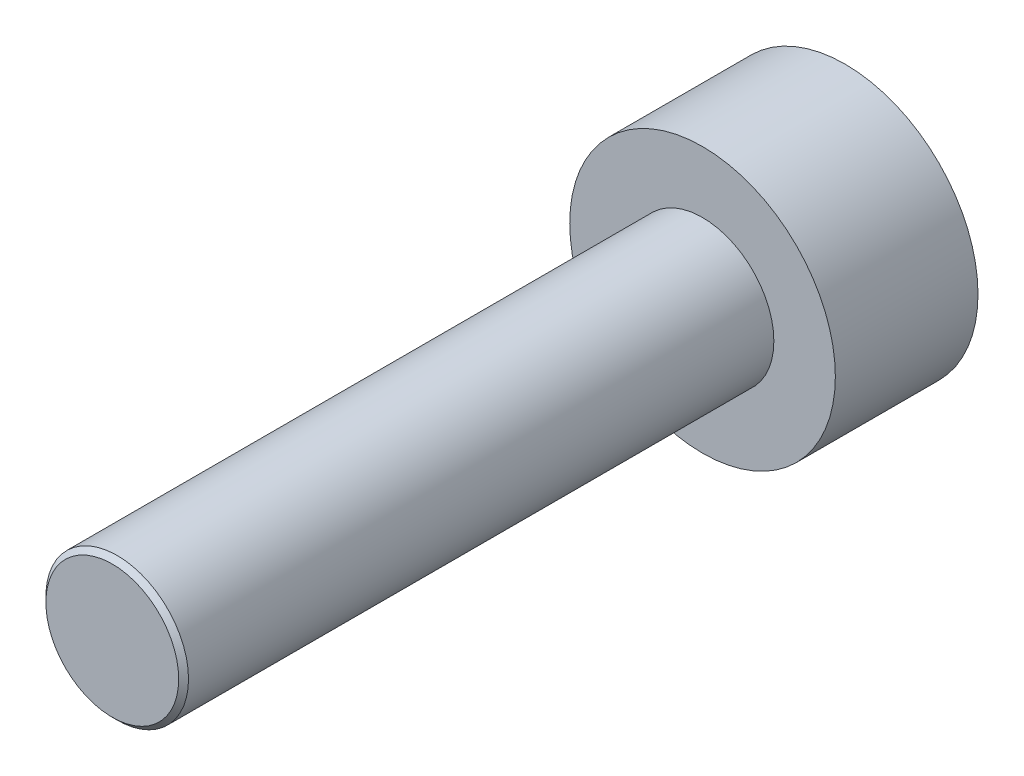
ISO-10303-21;
HEADER;
FILE_DESCRIPTION(('STEP AP214'),'2;1');
FILE_NAME('part.step','',(''),(''),'','','');
FILE_SCHEMA(('AUTOMOTIVE_DESIGN { 1 0 10303 214 1 1 1 1 }'));
ENDSEC;
DATA;
#1=APPLICATION_CONTEXT('core data for automotive mechanical design processes');
#2=APPLICATION_PROTOCOL_DEFINITION('international standard','automotive_design',2000,#1);
#3=PRODUCT_CONTEXT('',#1,'mechanical');
#4=PRODUCT('Part','Part','',(#3));
#5=PRODUCT_RELATED_PRODUCT_CATEGORY('part','',(#4));
#6=PRODUCT_DEFINITION_FORMATION('','',#4);
#7=PRODUCT_DEFINITION_CONTEXT('part definition',#1,'design');
#8=PRODUCT_DEFINITION('design','',#6,#7);
#9=PRODUCT_DEFINITION_SHAPE('','',#8);
#10=(LENGTH_UNIT() NAMED_UNIT(*) SI_UNIT(.MILLI.,.METRE.));
#11=(NAMED_UNIT(*) PLANE_ANGLE_UNIT() SI_UNIT($,.RADIAN.));
#12=(NAMED_UNIT(*) SI_UNIT($,.STERADIAN.) SOLID_ANGLE_UNIT());
#13=UNCERTAINTY_MEASURE_WITH_UNIT(LENGTH_MEASURE(1.E-05),#10,'distance_accuracy_value','');
#14=(GEOMETRIC_REPRESENTATION_CONTEXT(3) GLOBAL_UNCERTAINTY_ASSIGNED_CONTEXT((#13)) GLOBAL_UNIT_ASSIGNED_CONTEXT((#10,
#11,#12)) REPRESENTATION_CONTEXT('',''));
#15=CARTESIAN_POINT('',(0.,0.,0.));
#16=DIRECTION('',(0.,0.,1.));
#17=DIRECTION('',(1.,0.,0.));
#18=AXIS2_PLACEMENT_3D('',#15,#16,#17);
#19=CARTESIAN_POINT('',(0.,0.,2.9));
#20=DIRECTION('',(0.,0.,-1.));
#21=DIRECTION('',(-1.,0.,0.));
#22=AXIS2_PLACEMENT_3D('',#19,#20,#21);
#23=CYLINDRICAL_SURFACE('',#22,2.7);
#24=CARTESIAN_POINT('',(0.,0.,2.9));
#25=DIRECTION('',(0.,0.,1.));
#26=DIRECTION('',(1.,0.,0.));
#27=AXIS2_PLACEMENT_3D('',#24,#25,#26);
#28=CIRCLE('',#27,2.7);
#29=CARTESIAN_POINT('',(2.7,0.,2.9));
#30=VERTEX_POINT('',#29);
#31=EDGE_CURVE('E57',#30,#30,#28,.T.);
#32=ORIENTED_EDGE('',*,*,#31,.F.);
#33=EDGE_LOOP('',(#32));
#34=FACE_BOUND('',#33,.T.);
#35=CARTESIAN_POINT('',(0.,0.,0.));
#36=DIRECTION('',(0.,0.,1.));
#37=DIRECTION('',(1.,0.,0.));
#38=AXIS2_PLACEMENT_3D('',#35,#36,#37);
#39=CIRCLE('',#38,2.7);
#40=CARTESIAN_POINT('',(2.7,0.,0.));
#41=VERTEX_POINT('',#40);
#42=EDGE_CURVE('E60',#41,#41,#39,.T.);
#43=ORIENTED_EDGE('',*,*,#42,.T.);
#44=EDGE_LOOP('',(#43));
#45=FACE_BOUND('',#44,.T.);
#46=ADVANCED_FACE('F38',(#34,#45),#23,.T.);
#47=CARTESIAN_POINT('',(0.,0.,2.9));
#48=DIRECTION('',(0.,0.,1.));
#49=DIRECTION('',(1.,0.,0.));
#50=AXIS2_PLACEMENT_3D('',#47,#48,#49);
#51=PLANE('',#50);
#52=CARTESIAN_POINT('',(0.,0.,2.9));
#53=DIRECTION('',(0.,0.,1.));
#54=DIRECTION('',(1.,0.,0.));
#55=AXIS2_PLACEMENT_3D('',#52,#53,#54);
#56=CIRCLE('',#55,1.45);
#57=CARTESIAN_POINT('',(1.45,0.,2.9));
#58=VERTEX_POINT('',#57);
#59=EDGE_CURVE('E50',#58,#58,#56,.T.);
#60=ORIENTED_EDGE('',*,*,#59,.F.);
#61=EDGE_LOOP('',(#60));
#62=FACE_BOUND('',#61,.T.);
#63=ORIENTED_EDGE('',*,*,#31,.T.);
#64=EDGE_LOOP('',(#63));
#65=FACE_BOUND('',#64,.T.);
#66=ADVANCED_FACE('F67',(#62,#65),#51,.T.);
#67=CARTESIAN_POINT('',(0.,0.,0.));
#68=DIRECTION('',(0.,0.,1.));
#69=DIRECTION('',(1.,0.,0.));
#70=AXIS2_PLACEMENT_3D('',#67,#68,#69);
#71=PLANE('',#70);
#72=ORIENTED_EDGE('',*,*,#42,.F.);
#73=EDGE_LOOP('',(#72));
#74=FACE_BOUND('',#73,.T.);
#75=ADVANCED_FACE('F73',(#74),#71,.F.);
#76=CARTESIAN_POINT('',(0.,0.,14.9));
#77=DIRECTION('',(0.,0.,-1.));
#78=DIRECTION('',(-1.,0.,0.));
#79=AXIS2_PLACEMENT_3D('',#76,#77,#78);
#80=CYLINDRICAL_SURFACE('',#79,1.45);
#81=CARTESIAN_POINT('',(0.,0.,14.8));
#82=DIRECTION('',(0.,0.,1.));
#83=DIRECTION('',(1.,0.,0.));
#84=AXIS2_PLACEMENT_3D('',#81,#82,#83);
#85=CIRCLE('',#84,1.45);
#86=CARTESIAN_POINT('',(1.45,0.,14.8));
#87=VERTEX_POINT('',#86);
#88=EDGE_CURVE('E10',#87,#87,#85,.F.);
#89=ORIENTED_EDGE('',*,*,#88,.T.);
#90=EDGE_LOOP('',(#89));
#91=FACE_BOUND('',#90,.T.);
#92=ORIENTED_EDGE('',*,*,#59,.T.);
#93=EDGE_LOOP('',(#92));
#94=FACE_BOUND('',#93,.T.);
#95=ADVANCED_FACE('F75',(#91,#94),#80,.T.);
#96=CARTESIAN_POINT('',(0.,0.,14.9));
#97=DIRECTION('',(0.,0.,1.));
#98=DIRECTION('',(1.,0.,0.));
#99=AXIS2_PLACEMENT_3D('',#96,#97,#98);
#100=PLANE('',#99);
#101=CARTESIAN_POINT('',(0.,0.,14.9));
#102=DIRECTION('',(0.,0.,1.));
#103=DIRECTION('',(1.,0.,0.));
#104=AXIS2_PLACEMENT_3D('',#101,#102,#103);
#105=CIRCLE('',#104,1.35);
#106=CARTESIAN_POINT('',(1.35,0.,14.9));
#107=VERTEX_POINT('',#106);
#108=EDGE_CURVE('E45',#107,#107,#105,.T.);
#109=ORIENTED_EDGE('',*,*,#108,.T.);
#110=EDGE_LOOP('',(#109));
#111=FACE_BOUND('',#110,.T.);
#112=ADVANCED_FACE('F80',(#111),#100,.T.);
#113=CARTESIAN_POINT('',(0.,0.,14.9));
#114=DIRECTION('',(0.,0.,-1.));
#115=DIRECTION('',(-1.,0.,0.));
#116=AXIS2_PLACEMENT_3D('',#113,#114,#115);
#117=CONICAL_SURFACE('',#116,1.35,0.785398163397449);
#118=ORIENTED_EDGE('',*,*,#88,.F.);
#119=EDGE_LOOP('',(#118));
#120=FACE_BOUND('',#119,.T.);
#121=ORIENTED_EDGE('',*,*,#108,.F.);
#122=EDGE_LOOP('',(#121));
#123=FACE_BOUND('',#122,.T.);
#124=ADVANCED_FACE('F40',(#120,#123),#117,.T.);
#125=CLOSED_SHELL('',(#46,#66,#75,#95,#112,#124));
#126=MANIFOLD_SOLID_BREP('B2',#125);
#127=ADVANCED_BREP_SHAPE_REPRESENTATION('',(#18,#126),#14);
#128=SHAPE_DEFINITION_REPRESENTATION(#9,#127);
ENDSEC;
END-ISO-10303-21;
